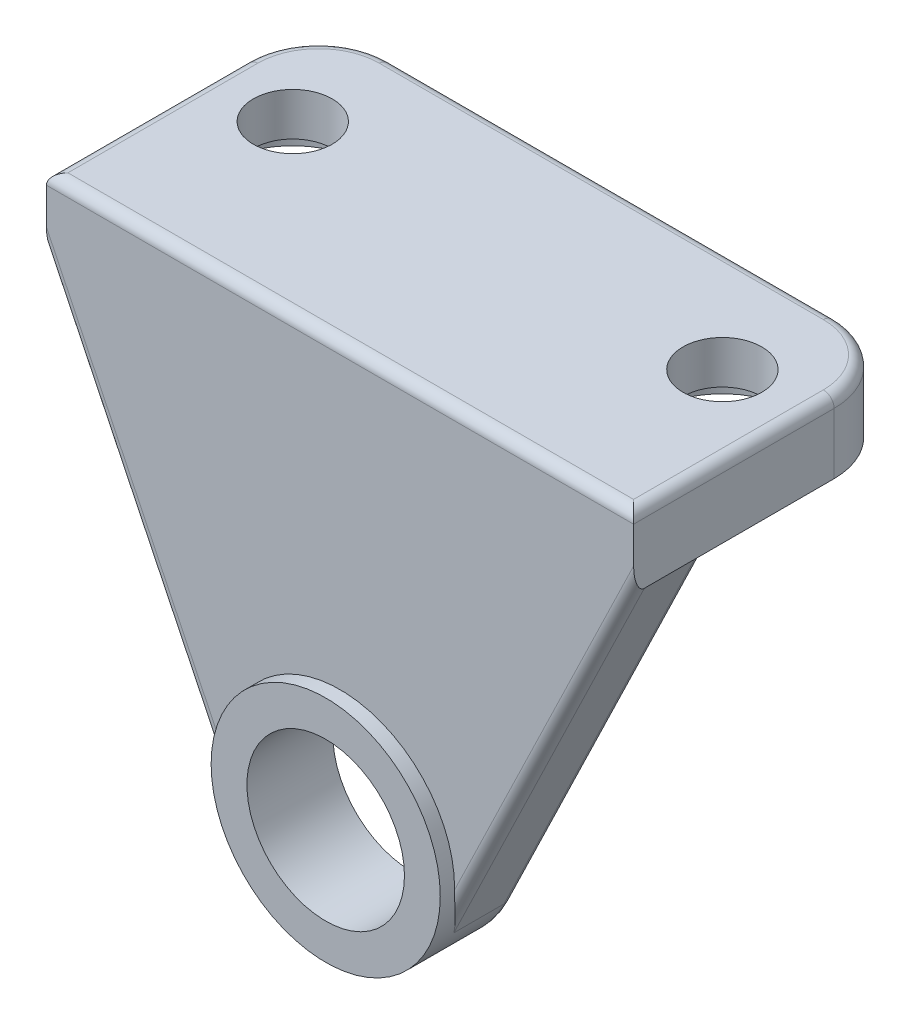
ISO-10303-21;
HEADER;
FILE_DESCRIPTION(('STEP AP214'),'2;1');
FILE_NAME('part.step','',(''),(''),'','','');
FILE_SCHEMA(('AUTOMOTIVE_DESIGN { 1 0 10303 214 1 1 1 1 }'));
ENDSEC;
DATA;
#1=APPLICATION_CONTEXT('core data for automotive mechanical design processes');
#2=APPLICATION_PROTOCOL_DEFINITION('international standard','automotive_design',2000,#1);
#3=PRODUCT_CONTEXT('',#1,'mechanical');
#4=PRODUCT('Part','Part','',(#3));
#5=PRODUCT_RELATED_PRODUCT_CATEGORY('part','',(#4));
#6=PRODUCT_DEFINITION_FORMATION('','',#4);
#7=PRODUCT_DEFINITION_CONTEXT('part definition',#1,'design');
#8=PRODUCT_DEFINITION('design','',#6,#7);
#9=PRODUCT_DEFINITION_SHAPE('','',#8);
#10=(LENGTH_UNIT() NAMED_UNIT(*) SI_UNIT(.MILLI.,.METRE.));
#11=(NAMED_UNIT(*) PLANE_ANGLE_UNIT() SI_UNIT($,.RADIAN.));
#12=(NAMED_UNIT(*) SI_UNIT($,.STERADIAN.) SOLID_ANGLE_UNIT());
#13=UNCERTAINTY_MEASURE_WITH_UNIT(LENGTH_MEASURE(1.E-05),#10,'distance_accuracy_value','');
#14=(GEOMETRIC_REPRESENTATION_CONTEXT(3) GLOBAL_UNCERTAINTY_ASSIGNED_CONTEXT((#13)) GLOBAL_UNIT_ASSIGNED_CONTEXT((#10,
#11,#12)) REPRESENTATION_CONTEXT('',''));
#15=CARTESIAN_POINT('',(0.,0.,0.));
#16=DIRECTION('',(0.,0.,1.));
#17=DIRECTION('',(1.,0.,0.));
#18=AXIS2_PLACEMENT_3D('',#15,#16,#17);
#19=CARTESIAN_POINT('',(-164.012658914919,48.,-38.));
#20=DIRECTION('',(0.,1.,0.));
#21=DIRECTION('',(0.,0.,1.));
#22=AXIS2_PLACEMENT_3D('',#19,#20,#21);
#23=PLANE('',#22);
#24=CARTESIAN_POINT('',(30.,48.,-23.4));
#25=DIRECTION('',(0.,-1.,0.));
#26=DIRECTION('',(0.,0.,-1.));
#27=AXIS2_PLACEMENT_3D('',#24,#25,#26);
#28=CIRCLE('',#27,9.99999999999998);
#29=CARTESIAN_POINT('',(30.,48.,-33.4));
#30=VERTEX_POINT('',#29);
#31=EDGE_CURVE('E438',#30,#30,#28,.T.);
#32=ORIENTED_EDGE('',*,*,#31,.F.);
#33=EDGE_LOOP('',(#32));
#34=FACE_BOUND('',#33,.T.);
#35=DIRECTION('',(0.,0.,1.));
#36=VECTOR('',#35,1.);
#37=CARTESIAN_POINT('',(-41.,48.,-38.));
#38=LINE('',#37,#36);
#39=CARTESIAN_POINT('',(-41.,48.,-28.));
#40=VERTEX_POINT('',#39);
#41=CARTESIAN_POINT('',(-41.,48.,-8.5));
#42=VERTEX_POINT('',#41);
#43=EDGE_CURVE('E55',#40,#42,#38,.T.);
#44=ORIENTED_EDGE('',*,*,#43,.F.);
#45=CARTESIAN_POINT('',(-31.,48.,-28.));
#46=DIRECTION('',(0.,1.,0.));
#47=DIRECTION('',(0.,0.,1.));
#48=AXIS2_PLACEMENT_3D('',#45,#46,#47);
#49=CIRCLE('',#48,10.);
#50=CARTESIAN_POINT('',(-31.,48.,-38.));
#51=VERTEX_POINT('',#50);
#52=EDGE_CURVE('E168',#40,#51,#49,.F.);
#53=ORIENTED_EDGE('',*,*,#52,.T.);
#54=DIRECTION('',(-1.,0.,0.));
#55=VECTOR('',#54,1.);
#56=CARTESIAN_POINT('',(0.,48.,-38.));
#57=LINE('',#56,#55);
#58=CARTESIAN_POINT('',(31.,48.,-38.));
#59=VERTEX_POINT('',#58);
#60=EDGE_CURVE('E151',#59,#51,#57,.T.);
#61=ORIENTED_EDGE('',*,*,#60,.F.);
#62=CARTESIAN_POINT('',(31.,48.,-28.));
#63=DIRECTION('',(0.,1.,0.));
#64=DIRECTION('',(0.,0.,1.));
#65=AXIS2_PLACEMENT_3D('',#62,#63,#64);
#66=CIRCLE('',#65,10.);
#67=CARTESIAN_POINT('',(41.,48.,-28.));
#68=VERTEX_POINT('',#67);
#69=EDGE_CURVE('E165',#59,#68,#66,.F.);
#70=ORIENTED_EDGE('',*,*,#69,.T.);
#71=DIRECTION('',(0.,0.,1.));
#72=VECTOR('',#71,1.);
#73=CARTESIAN_POINT('',(41.,48.,-38.));
#74=LINE('',#73,#72);
#75=CARTESIAN_POINT('',(41.,48.,-8.5));
#76=VERTEX_POINT('',#75);
#77=EDGE_CURVE('E409',#68,#76,#74,.T.);
#78=ORIENTED_EDGE('',*,*,#77,.T.);
#79=CARTESIAN_POINT('',(39.3336334098914,48.,-8.5));
#80=DIRECTION('',(0.,1.,0.));
#81=DIRECTION('',(1.,0.,0.));
#82=AXIS2_PLACEMENT_3D('',#79,#80,#81);
#83=ELLIPSE('',#82,1.66636659010857,1.5);
#84=CARTESIAN_POINT('',(39.3336334098914,48.,-10.));
#85=VERTEX_POINT('',#84);
#86=EDGE_CURVE('E246',#76,#85,#83,.T.);
#87=ORIENTED_EDGE('',*,*,#86,.T.);
#88=DIRECTION('',(1.,0.,0.));
#89=VECTOR('',#88,1.);
#90=CARTESIAN_POINT('',(-164.012658914919,48.,-10.));
#91=LINE('',#90,#89);
#92=CARTESIAN_POINT('',(-39.3336334098914,48.,-10.));
#93=VERTEX_POINT('',#92);
#94=EDGE_CURVE('E417',#93,#85,#91,.T.);
#95=ORIENTED_EDGE('',*,*,#94,.F.);
#96=CARTESIAN_POINT('',(-39.3336334098914,48.,-8.5));
#97=DIRECTION('',(0.,1.,0.));
#98=DIRECTION('',(1.,0.,0.));
#99=AXIS2_PLACEMENT_3D('',#96,#97,#98);
#100=ELLIPSE('',#99,1.66636659010857,1.5);
#101=EDGE_CURVE('E243',#93,#42,#100,.T.);
#102=ORIENTED_EDGE('',*,*,#101,.T.);
#103=EDGE_LOOP('',(#44,#53,#61,#70,#78,#87,#95,#102));
#104=FACE_BOUND('',#103,.T.);
#105=CARTESIAN_POINT('',(-30.,48.,-23.4));
#106=DIRECTION('',(0.,-1.,0.));
#107=DIRECTION('',(0.,0.,-1.));
#108=AXIS2_PLACEMENT_3D('',#105,#106,#107);
#109=CIRCLE('',#108,9.99999999999999);
#110=CARTESIAN_POINT('',(-30.,48.,-33.4));
#111=VERTEX_POINT('',#110);
#112=EDGE_CURVE('E371',#111,#111,#109,.T.);
#113=ORIENTED_EDGE('',*,*,#112,.F.);
#114=EDGE_LOOP('',(#113));
#115=FACE_BOUND('',#114,.T.);
#116=ADVANCED_FACE('F36',(#34,#104,#115),#23,.F.);
#117=CARTESIAN_POINT('',(-41.,58.,-38.));
#118=DIRECTION('',(0.,-1.,0.));
#119=DIRECTION('',(1.,0.,0.));
#120=AXIS2_PLACEMENT_3D('',#117,#118,#119);
#121=PLANE('',#120);
#122=DIRECTION('',(0.,0.,1.));
#123=VECTOR('',#122,1.);
#124=CARTESIAN_POINT('',(39.5,58.,-28.));
#125=LINE('',#124,#123);
#126=CARTESIAN_POINT('',(39.5,58.,-1.5));
#127=VERTEX_POINT('',#126);
#128=CARTESIAN_POINT('',(39.5,58.,-28.));
#129=VERTEX_POINT('',#128);
#130=EDGE_CURVE('E213',#127,#129,#125,.F.);
#131=ORIENTED_EDGE('',*,*,#130,.T.);
#132=CARTESIAN_POINT('',(31.,58.,-28.));
#133=DIRECTION('',(0.,-1.,0.));
#134=DIRECTION('',(1.,0.,0.));
#135=AXIS2_PLACEMENT_3D('',#132,#133,#134);
#136=CIRCLE('',#135,8.5);
#137=CARTESIAN_POINT('',(31.,58.,-36.5));
#138=VERTEX_POINT('',#137);
#139=EDGE_CURVE('E215',#129,#138,#136,.F.);
#140=ORIENTED_EDGE('',*,*,#139,.T.);
#141=DIRECTION('',(1.,0.,0.));
#142=VECTOR('',#141,1.);
#143=CARTESIAN_POINT('',(-41.,58.,-36.5));
#144=LINE('',#143,#142);
#145=CARTESIAN_POINT('',(-31.,58.,-36.5));
#146=VERTEX_POINT('',#145);
#147=EDGE_CURVE('E205',#138,#146,#144,.F.);
#148=ORIENTED_EDGE('',*,*,#147,.T.);
#149=CARTESIAN_POINT('',(-31.,58.,-28.));
#150=DIRECTION('',(0.,-1.,0.));
#151=DIRECTION('',(1.,0.,0.));
#152=AXIS2_PLACEMENT_3D('',#149,#150,#151);
#153=CIRCLE('',#152,8.5);
#154=CARTESIAN_POINT('',(-39.5,58.,-28.));
#155=VERTEX_POINT('',#154);
#156=EDGE_CURVE('E207',#146,#155,#153,.F.);
#157=ORIENTED_EDGE('',*,*,#156,.T.);
#158=DIRECTION('',(0.,0.,1.));
#159=VECTOR('',#158,1.);
#160=CARTESIAN_POINT('',(-39.5,58.,-38.));
#161=LINE('',#160,#159);
#162=CARTESIAN_POINT('',(-39.5,58.,-1.5));
#163=VERTEX_POINT('',#162);
#164=EDGE_CURVE('E209',#155,#163,#161,.T.);
#165=ORIENTED_EDGE('',*,*,#164,.T.);
#166=DIRECTION('',(1.,0.,0.));
#167=VECTOR('',#166,1.);
#168=CARTESIAN_POINT('',(41.,58.,-1.5));
#169=LINE('',#168,#167);
#170=EDGE_CURVE('E211',#163,#127,#169,.T.);
#171=ORIENTED_EDGE('',*,*,#170,.T.);
#172=EDGE_LOOP('',(#131,#140,#148,#157,#165,#171));
#173=FACE_BOUND('',#172,.T.);
#174=CARTESIAN_POINT('',(30.,58.,-23.4));
#175=DIRECTION('',(0.,-1.,0.));
#176=DIRECTION('',(0.,0.,-1.));
#177=AXIS2_PLACEMENT_3D('',#174,#175,#176);
#178=CIRCLE('',#177,5.50000000000001);
#179=CARTESIAN_POINT('',(30.,58.,-28.9));
#180=VERTEX_POINT('',#179);
#181=EDGE_CURVE('E429',#180,#180,#178,.T.);
#182=ORIENTED_EDGE('',*,*,#181,.T.);
#183=EDGE_LOOP('',(#182));
#184=FACE_BOUND('',#183,.T.);
#185=CARTESIAN_POINT('',(-30.,58.,-23.4));
#186=DIRECTION('',(0.,-1.,0.));
#187=DIRECTION('',(0.,0.,-1.));
#188=AXIS2_PLACEMENT_3D('',#185,#186,#187);
#189=CIRCLE('',#188,5.50000000000001);
#190=CARTESIAN_POINT('',(-30.,58.,-28.9));
#191=VERTEX_POINT('',#190);
#192=EDGE_CURVE('E441',#191,#191,#189,.T.);
#193=ORIENTED_EDGE('',*,*,#192,.T.);
#194=EDGE_LOOP('',(#193));
#195=FACE_BOUND('',#194,.T.);
#196=ADVANCED_FACE('F316',(#173,#184,#195),#121,.F.);
#197=CARTESIAN_POINT('',(0.,0.,-38.));
#198=DIRECTION('',(0.,0.,1.));
#199=DIRECTION('',(1.,0.,0.));
#200=AXIS2_PLACEMENT_3D('',#197,#198,#199);
#201=CYLINDRICAL_SURFACE('',#200,16.);
#202=DIRECTION('',(0.,0.,1.));
#203=VECTOR('',#202,1.);
#204=CARTESIAN_POINT('',(-14.4025931283442,-6.96888163046068,-38.));
#205=LINE('',#204,#203);
#206=CARTESIAN_POINT('',(-14.4025931283442,-6.96888163046068,-8.5));
#207=VERTEX_POINT('',#206);
#208=CARTESIAN_POINT('',(-14.4025931283442,-6.96888163046068,-1.5));
#209=VERTEX_POINT('',#208);
#210=EDGE_CURVE('E169',#207,#209,#205,.T.);
#211=ORIENTED_EDGE('',*,*,#210,.F.);
#212=CARTESIAN_POINT('',(0.,0.,-8.5));
#213=DIRECTION('',(0.,0.,1.));
#214=DIRECTION('',(0.,-1.,0.));
#215=AXIS2_PLACEMENT_3D('',#212,#213,#214);
#216=CIRCLE('',#215,16.);
#217=CARTESIAN_POINT('',(14.4025931283442,-6.96888163046068,-8.5));
#218=VERTEX_POINT('',#217);
#219=EDGE_CURVE('E203',#207,#218,#216,.T.);
#220=ORIENTED_EDGE('',*,*,#219,.T.);
#221=DIRECTION('',(0.,0.,1.));
#222=VECTOR('',#221,1.);
#223=CARTESIAN_POINT('',(14.4025931283442,-6.96888163046068,-38.));
#224=LINE('',#223,#222);
#225=CARTESIAN_POINT('',(14.4025931283442,-6.96888163046068,-1.5));
#226=VERTEX_POINT('',#225);
#227=EDGE_CURVE('E193',#218,#226,#224,.T.);
#228=ORIENTED_EDGE('',*,*,#227,.T.);
#229=CARTESIAN_POINT('',(15.9983901259626,-0.226965586605466,0.));
#230=CARTESIAN_POINT('',(15.9965838851266,-0.354482405872986,-2.54390660362477E-05));
#231=CARTESIAN_POINT('',(15.99324802249,-0.481945304262293,-0.00290536536573818));
#232=CARTESIAN_POINT('',(15.9835467885786,-0.736493711316117,-0.0136774598857194));
#233=CARTESIAN_POINT('',(15.9771827080948,-0.863579357583061,-0.021567493005181));
#234=CARTESIAN_POINT('',(15.9614681302463,-1.11697174134248,-0.0416451820041529));
#235=CARTESIAN_POINT('',(15.9521233300004,-1.24327949997777,-0.0538246439857067));
#236=CARTESIAN_POINT('',(15.9304827566261,-1.49522905868356,-0.0819426286752582));
#237=CARTESIAN_POINT('',(15.9181866256102,-1.62087077609784,-0.0978816072697057));
#238=CARTESIAN_POINT('',(15.8770443412948,-1.9956034774908,-0.150470590463817));
#239=CARTESIAN_POINT('',(15.8438782574361,-2.24355655715325,-0.191984418831265));
#240=CARTESIAN_POINT('',(15.7663286088091,-2.73588336543472,-0.285031259189174));
#241=CARTESIAN_POINT('',(15.7219381708936,-2.98025480350905,-0.336570405628843));
#242=CARTESIAN_POINT('',(15.6050583014365,-3.54864740254916,-0.466461292089114));
#243=CARTESIAN_POINT('',(15.5281583207196,-3.87106029130972,-0.547928820214518));
#244=CARTESIAN_POINT('',(15.3553444320515,-4.50803618362231,-0.720340395044808));
#245=CARTESIAN_POINT('',(15.2594287056812,-4.8225984331996,-0.811285347652766));
#246=CARTESIAN_POINT('',(14.9438138023887,-5.75433319956717,-1.09308644318132));
#247=CARTESIAN_POINT('',(14.6961996768158,-6.35978040111449,-1.29296572789201));
#248=CARTESIAN_POINT('',(14.4096115536977,-6.95436264243241,-1.49506235149203));
#249=CARTESIAN_POINT('',(14.4061050522366,-6.96162352523192,-1.49753120660401));
#250=CARTESIAN_POINT('',(14.4025931283442,-6.96888163046068,-1.5));
#251=B_SPLINE_CURVE_WITH_KNOTS('',3,(#229,#230,#231,#232,#233,#234,#235,#236,#237,#238,#239,
#240,#241,#242,#243,#244,#245,#246,#247,#248,#249,#250),.UNSPECIFIED.,.F.,.F.,(4,2,2,2,2,2,2,2,
2,2,4),(0.,0.382501537564101,0.764840178051784,1.1464523811574,1.52811088312843,
2.28825350975727,3.04886273592473,4.07189168749172,5.09501851550318,7.14056143828107,
7.165859666171),.UNSPECIFIED.);
#252=CARTESIAN_POINT('',(15.9983901259626,-0.226965586605466,0.));
#253=VERTEX_POINT('',#252);
#254=EDGE_CURVE('E47',#226,#253,#251,.F.);
#255=ORIENTED_EDGE('',*,*,#254,.T.);
#256=CARTESIAN_POINT('',(0.,0.,0.));
#257=DIRECTION('',(0.,0.,1.));
#258=DIRECTION('',(1.,0.,0.));
#259=AXIS2_PLACEMENT_3D('',#256,#257,#258);
#260=CIRCLE('',#259,16.);
#261=CARTESIAN_POINT('',(-15.9983901259626,-0.226965586605454,0.));
#262=VERTEX_POINT('',#261);
#263=EDGE_CURVE('E160',#253,#262,#260,.T.);
#264=ORIENTED_EDGE('',*,*,#263,.T.);
#265=CARTESIAN_POINT('',(-15.9983901259626,-0.226965586605454,0.));
#266=CARTESIAN_POINT('',(-15.9965838851266,-0.354482405873452,-2.54390660387299E-05));
#267=CARTESIAN_POINT('',(-15.9932480224899,-0.481945304263236,-0.00290536536576218));
#268=CARTESIAN_POINT('',(-15.9835467885785,-0.736493711318013,-0.0136774598858207));
#269=CARTESIAN_POINT('',(-15.9771827080947,-0.863579357585432,-0.0215674930053381));
#270=CARTESIAN_POINT('',(-15.9614681302461,-1.11697174134569,-0.0416451820044435));
#271=CARTESIAN_POINT('',(-15.9521233300002,-1.24327949998135,-0.0538246439860715));
#272=CARTESIAN_POINT('',(-15.9304827566257,-1.49522905868786,-0.0819426286757815));
#273=CARTESIAN_POINT('',(-15.9181866256098,-1.6208707761025,-0.0978816072703131));
#274=CARTESIAN_POINT('',(-15.8770443412942,-1.9956034774949,-0.150470590464498));
#275=CARTESIAN_POINT('',(-15.8438782574356,-2.24355655715644,-0.191984418831901));
#276=CARTESIAN_POINT('',(-15.7663286088088,-2.73588336543627,-0.285031259189445));
#277=CARTESIAN_POINT('',(-15.7219381708934,-2.98025480350987,-0.336570405628798));
#278=CARTESIAN_POINT('',(-15.6050583014366,-3.54864740254896,-0.466461292089406));
#279=CARTESIAN_POINT('',(-15.5281583207198,-3.87106029130915,-0.547928820215801));
#280=CARTESIAN_POINT('',(-15.3553444320515,-4.50803618362212,-0.720340395043345));
#281=CARTESIAN_POINT('',(-15.2594287056807,-4.82259843320016,-0.811285347647561));
#282=CARTESIAN_POINT('',(-14.9438138023904,-5.75433319956375,-1.09308644319111));
#283=CARTESIAN_POINT('',(-14.6961996768233,-6.35978040109917,-1.2929657279465));
#284=CARTESIAN_POINT('',(-14.4096115536978,-6.95436264243206,-1.49506235149338));
#285=CARTESIAN_POINT('',(-14.4061050522367,-6.96162352523174,-1.49753120660469));
#286=CARTESIAN_POINT('',(-14.4025931283442,-6.96888163046068,-1.5));
#287=B_SPLINE_CURVE_WITH_KNOTS('',3,(#265,#266,#267,#268,#269,#270,#271,#272,#273,#274,#275,
#276,#277,#278,#279,#280,#281,#282,#283,#284,#285,#286),.UNSPECIFIED.,.F.,.F.,(4,2,2,2,2,2,2,2,
2,2,4),(0.,0.382501537565535,0.764840178054653,1.14645238116139,1.52811088313354,
2.28825350975967,3.04886273592473,4.07189168749141,5.09501851550205,7.14056143828109,
7.165859666171),.UNSPECIFIED.);
#288=EDGE_CURVE('E11',#262,#209,#287,.T.);
#289=ORIENTED_EDGE('',*,*,#288,.T.);
#290=EDGE_LOOP('',(#211,#220,#228,#255,#264,#289));
#291=FACE_BOUND('',#290,.T.);
#292=CARTESIAN_POINT('',(0.,0.,2.));
#293=DIRECTION('',(0.,0.,1.));
#294=DIRECTION('',(1.,0.,0.));
#295=AXIS2_PLACEMENT_3D('',#292,#293,#294);
#296=CIRCLE('',#295,16.);
#297=CARTESIAN_POINT('',(16.,0.,2.));
#298=VERTEX_POINT('',#297);
#299=EDGE_CURVE('E420',#298,#298,#296,.T.);
#300=ORIENTED_EDGE('',*,*,#299,.F.);
#301=EDGE_LOOP('',(#300));
#302=FACE_BOUND('',#301,.T.);
#303=ADVANCED_FACE('F258',(#291,#302),#201,.T.);
#304=CARTESIAN_POINT('',(-14.4025931283442,-6.96888163046068,-38.));
#305=DIRECTION('',(0.900162070521513,0.435555101903792,0.));
#306=DIRECTION('',(-0.435555101903792,0.900162070521513,0.));
#307=AXIS2_PLACEMENT_3D('',#304,#305,#306);
#308=PLANE('',#307);
#309=CARTESIAN_POINT('',(-41.,48.,-1.5));
#310=VERTEX_POINT('',#309);
#311=EDGE_CURVE('E410',#42,#310,#38,.T.);
#312=ORIENTED_EDGE('',*,*,#311,.F.);
#313=DIRECTION('',(0.435555101903792,-0.900162070521513,0.));
#314=VECTOR('',#313,1.);
#315=CARTESIAN_POINT('',(-14.4025931283442,-6.96888163046068,-8.5));
#316=LINE('',#315,#314);
#317=EDGE_CURVE('E492',#42,#207,#316,.T.);
#318=ORIENTED_EDGE('',*,*,#317,.T.);
#319=ORIENTED_EDGE('',*,*,#210,.T.);
#320=DIRECTION('',(-0.435555101903792,0.900162070521513,0.));
#321=VECTOR('',#320,1.);
#322=CARTESIAN_POINT('',(-41.,48.,-1.5));
#323=LINE('',#322,#321);
#324=EDGE_CURVE('E182',#209,#310,#323,.T.);
#325=ORIENTED_EDGE('',*,*,#324,.T.);
#326=EDGE_LOOP('',(#312,#318,#319,#325));
#327=FACE_BOUND('',#326,.T.);
#328=ADVANCED_FACE('F340',(#327),#308,.F.);
#329=CARTESIAN_POINT('',(-41.,48.,-38.));
#330=DIRECTION('',(1.,0.,0.));
#331=DIRECTION('',(0.,0.,-1.));
#332=AXIS2_PLACEMENT_3D('',#329,#330,#331);
#333=PLANE('',#332);
#334=DIRECTION('',(0.,1.,0.));
#335=VECTOR('',#334,1.);
#336=CARTESIAN_POINT('',(-41.,48.,0.));
#337=LINE('',#336,#335);
#338=CARTESIAN_POINT('',(-41.,51.4438811379859,0.));
#339=VERTEX_POINT('',#338);
#340=CARTESIAN_POINT('',(-41.,56.5,0.));
#341=VERTEX_POINT('',#340);
#342=EDGE_CURVE('E198',#339,#341,#337,.T.);
#343=ORIENTED_EDGE('',*,*,#342,.T.);
#344=DIRECTION('',(0.,0.,1.));
#345=VECTOR('',#344,1.);
#346=CARTESIAN_POINT('',(-41.,56.5,-38.));
#347=LINE('',#346,#345);
#348=CARTESIAN_POINT('',(-41.,56.5,-28.));
#349=VERTEX_POINT('',#348);
#350=EDGE_CURVE('E233',#341,#349,#347,.F.);
#351=ORIENTED_EDGE('',*,*,#350,.T.);
#352=DIRECTION('',(0.,1.,0.));
#353=VECTOR('',#352,1.);
#354=CARTESIAN_POINT('',(-41.,48.,-28.));
#355=LINE('',#354,#353);
#356=EDGE_CURVE('E175',#349,#40,#355,.F.);
#357=ORIENTED_EDGE('',*,*,#356,.T.);
#358=ORIENTED_EDGE('',*,*,#43,.T.);
#359=ORIENTED_EDGE('',*,*,#311,.T.);
#360=CARTESIAN_POINT('',(-41.,51.4438811379859,-1.5));
#361=DIRECTION('',(1.,0.,0.));
#362=DIRECTION('',(0.,-1.,0.));
#363=AXIS2_PLACEMENT_3D('',#360,#361,#362);
#364=ELLIPSE('',#363,3.44388113798591,1.5);
#365=EDGE_CURVE('E231',#310,#339,#364,.F.);
#366=ORIENTED_EDGE('',*,*,#365,.T.);
#367=EDGE_LOOP('',(#343,#351,#357,#358,#359,#366));
#368=FACE_BOUND('',#367,.T.);
#369=ADVANCED_FACE('F343',(#368),#333,.F.);
#370=CARTESIAN_POINT('',(41.,48.,-38.));
#371=DIRECTION('',(1.,0.,0.));
#372=DIRECTION('',(0.,0.,-1.));
#373=AXIS2_PLACEMENT_3D('',#370,#371,#372);
#374=PLANE('',#373);
#375=DIRECTION('',(0.,1.,0.));
#376=VECTOR('',#375,1.);
#377=CARTESIAN_POINT('',(41.,58.,-28.));
#378=LINE('',#377,#376);
#379=CARTESIAN_POINT('',(41.,56.5,-28.));
#380=VERTEX_POINT('',#379);
#381=EDGE_CURVE('E174',#68,#380,#378,.T.);
#382=ORIENTED_EDGE('',*,*,#381,.T.);
#383=DIRECTION('',(0.,0.,1.));
#384=VECTOR('',#383,1.);
#385=CARTESIAN_POINT('',(41.,56.5,0.));
#386=LINE('',#385,#384);
#387=CARTESIAN_POINT('',(41.,56.5,0.));
#388=VERTEX_POINT('',#387);
#389=EDGE_CURVE('E222',#380,#388,#386,.T.);
#390=ORIENTED_EDGE('',*,*,#389,.T.);
#391=DIRECTION('',(0.,1.,0.));
#392=VECTOR('',#391,1.);
#393=CARTESIAN_POINT('',(41.,48.,0.));
#394=LINE('',#393,#392);
#395=CARTESIAN_POINT('',(41.,51.4438811379859,0.));
#396=VERTEX_POINT('',#395);
#397=EDGE_CURVE('E415',#396,#388,#394,.T.);
#398=ORIENTED_EDGE('',*,*,#397,.F.);
#399=CARTESIAN_POINT('',(41.,51.4438811379859,-1.5));
#400=DIRECTION('',(1.,0.,0.));
#401=DIRECTION('',(0.,1.,0.));
#402=AXIS2_PLACEMENT_3D('',#399,#400,#401);
#403=ELLIPSE('',#402,3.44388113798591,1.5);
#404=CARTESIAN_POINT('',(41.,48.,-1.5));
#405=VERTEX_POINT('',#404);
#406=EDGE_CURVE('E220',#396,#405,#403,.T.);
#407=ORIENTED_EDGE('',*,*,#406,.T.);
#408=EDGE_CURVE('E197',#76,#405,#74,.T.);
#409=ORIENTED_EDGE('',*,*,#408,.F.);
#410=ORIENTED_EDGE('',*,*,#77,.F.);
#411=EDGE_LOOP('',(#382,#390,#398,#407,#409,#410));
#412=FACE_BOUND('',#411,.T.);
#413=ADVANCED_FACE('F346',(#412),#374,.T.);
#414=CARTESIAN_POINT('',(14.4025931283442,-6.96888163046068,-38.));
#415=DIRECTION('',(0.900162070521513,-0.435555101903792,0.));
#416=DIRECTION('',(0.435555101903792,0.900162070521513,0.));
#417=AXIS2_PLACEMENT_3D('',#414,#415,#416);
#418=PLANE('',#417);
#419=ORIENTED_EDGE('',*,*,#227,.F.);
#420=DIRECTION('',(-0.435555101903792,-0.900162070521513,0.));
#421=VECTOR('',#420,1.);
#422=CARTESIAN_POINT('',(41.,48.,-8.5));
#423=LINE('',#422,#421);
#424=EDGE_CURVE('E240',#218,#76,#423,.F.);
#425=ORIENTED_EDGE('',*,*,#424,.T.);
#426=ORIENTED_EDGE('',*,*,#408,.T.);
#427=DIRECTION('',(0.435555101903792,0.900162070521513,0.));
#428=VECTOR('',#427,1.);
#429=CARTESIAN_POINT('',(14.4025931283442,-6.96888163046068,-1.5));
#430=LINE('',#429,#428);
#431=EDGE_CURVE('E238',#405,#226,#430,.F.);
#432=ORIENTED_EDGE('',*,*,#431,.T.);
#433=EDGE_LOOP('',(#419,#425,#426,#432));
#434=FACE_BOUND('',#433,.T.);
#435=ADVANCED_FACE('F336',(#434),#418,.T.);
#436=CARTESIAN_POINT('',(0.,0.,-38.));
#437=DIRECTION('',(0.,0.,1.));
#438=DIRECTION('',(1.,0.,0.));
#439=AXIS2_PLACEMENT_3D('',#436,#437,#438);
#440=PLANE('',#439);
#441=DIRECTION('',(0.,1.,0.));
#442=VECTOR('',#441,1.);
#443=CARTESIAN_POINT('',(-31.,0.,-38.));
#444=LINE('',#443,#442);
#445=CARTESIAN_POINT('',(-31.,56.5,-38.));
#446=VERTEX_POINT('',#445);
#447=EDGE_CURVE('E159',#51,#446,#444,.T.);
#448=ORIENTED_EDGE('',*,*,#447,.T.);
#449=DIRECTION('',(1.,0.,0.));
#450=VECTOR('',#449,1.);
#451=CARTESIAN_POINT('',(0.,56.5,-38.));
#452=LINE('',#451,#450);
#453=CARTESIAN_POINT('',(31.,56.5,-38.));
#454=VERTEX_POINT('',#453);
#455=EDGE_CURVE('E154',#446,#454,#452,.T.);
#456=ORIENTED_EDGE('',*,*,#455,.T.);
#457=DIRECTION('',(0.,1.,0.));
#458=VECTOR('',#457,1.);
#459=CARTESIAN_POINT('',(31.,48.,-38.));
#460=LINE('',#459,#458);
#461=EDGE_CURVE('E147',#454,#59,#460,.F.);
#462=ORIENTED_EDGE('',*,*,#461,.T.);
#463=ORIENTED_EDGE('',*,*,#60,.T.);
#464=EDGE_LOOP('',(#448,#456,#462,#463));
#465=FACE_BOUND('',#464,.T.);
#466=ADVANCED_FACE('F150',(#465),#440,.F.);
#467=CARTESIAN_POINT('',(0.,0.,0.));
#468=DIRECTION('',(0.,0.,1.));
#469=DIRECTION('',(1.,0.,0.));
#470=AXIS2_PLACEMENT_3D('',#467,#468,#469);
#471=PLANE('',#470);
#472=ORIENTED_EDGE('',*,*,#397,.T.);
#473=DIRECTION('',(1.,0.,0.));
#474=VECTOR('',#473,1.);
#475=CARTESIAN_POINT('',(-41.,56.5,0.));
#476=LINE('',#475,#474);
#477=EDGE_CURVE('E229',#388,#341,#476,.F.);
#478=ORIENTED_EDGE('',*,*,#477,.T.);
#479=ORIENTED_EDGE('',*,*,#342,.F.);
#480=DIRECTION('',(-0.435555101903792,0.900162070521513,0.));
#481=VECTOR('',#480,1.);
#482=CARTESIAN_POINT('',(-13.0523500225619,-6.31554897760499,0.));
#483=LINE('',#482,#481);
#484=EDGE_CURVE('E224',#339,#262,#483,.F.);
#485=ORIENTED_EDGE('',*,*,#484,.T.);
#486=ORIENTED_EDGE('',*,*,#263,.F.);
#487=DIRECTION('',(0.435555101903792,0.900162070521513,0.));
#488=VECTOR('',#487,1.);
#489=CARTESIAN_POINT('',(13.0523500225619,-6.31554897760499,0.));
#490=LINE('',#489,#488);
#491=EDGE_CURVE('E226',#253,#396,#490,.T.);
#492=ORIENTED_EDGE('',*,*,#491,.T.);
#493=EDGE_LOOP('',(#472,#478,#479,#485,#486,#492));
#494=FACE_BOUND('',#493,.T.);
#495=ADVANCED_FACE('F332',(#494),#471,.T.);
#496=CARTESIAN_POINT('',(-164.012658914919,-38.8535040205495,-10.));
#497=DIRECTION('',(0.,0.,1.));
#498=DIRECTION('',(0.,-1.,0.));
#499=AXIS2_PLACEMENT_3D('',#496,#497,#498);
#500=PLANE('',#499);
#501=CARTESIAN_POINT('',(0.,0.,-10.));
#502=DIRECTION('',(0.,0.,1.));
#503=DIRECTION('',(0.,-1.,0.));
#504=AXIS2_PLACEMENT_3D('',#501,#502,#503);
#505=CIRCLE('',#504,11.);
#506=CARTESIAN_POINT('',(0.,-11.,-10.));
#507=VERTEX_POINT('',#506);
#508=EDGE_CURVE('E423',#507,#507,#505,.T.);
#509=ORIENTED_EDGE('',*,*,#508,.T.);
#510=EDGE_LOOP('',(#509));
#511=FACE_BOUND('',#510,.T.);
#512=CARTESIAN_POINT('',(0.,0.,-10.));
#513=DIRECTION('',(0.,0.,1.));
#514=DIRECTION('',(0.,-1.,0.));
#515=AXIS2_PLACEMENT_3D('',#512,#513,#514);
#516=CIRCLE('',#515,14.5);
#517=CARTESIAN_POINT('',(13.052350022562,-6.31554897760499,-10.));
#518=VERTEX_POINT('',#517);
#519=CARTESIAN_POINT('',(-13.0523500225619,-6.31554897760499,-10.));
#520=VERTEX_POINT('',#519);
#521=EDGE_CURVE('E370',#518,#520,#516,.F.);
#522=ORIENTED_EDGE('',*,*,#521,.T.);
#523=DIRECTION('',(0.435555101903792,-0.900162070521513,0.));
#524=VECTOR('',#523,1.);
#525=CARTESIAN_POINT('',(-28.9336035908993,26.5062502208565,-10.));
#526=LINE('',#525,#524);
#527=EDGE_CURVE('E199',#520,#93,#526,.F.);
#528=ORIENTED_EDGE('',*,*,#527,.T.);
#529=ORIENTED_EDGE('',*,*,#94,.T.);
#530=DIRECTION('',(-0.435555101903792,-0.900162070521513,0.));
#531=VECTOR('',#530,1.);
#532=CARTESIAN_POINT('',(13.052350022562,-6.31554897760499,-10.));
#533=LINE('',#532,#531);
#534=EDGE_CURVE('E489',#85,#518,#533,.T.);
#535=ORIENTED_EDGE('',*,*,#534,.T.);
#536=EDGE_LOOP('',(#522,#528,#529,#535));
#537=FACE_BOUND('',#536,.T.);
#538=ADVANCED_FACE('F329',(#511,#537),#500,.F.);
#539=CARTESIAN_POINT('',(0.,0.,2.));
#540=DIRECTION('',(0.,0.,1.));
#541=DIRECTION('',(1.,0.,0.));
#542=AXIS2_PLACEMENT_3D('',#539,#540,#541);
#543=PLANE('',#542);
#544=CARTESIAN_POINT('',(0.,0.,2.));
#545=DIRECTION('',(0.,0.,1.));
#546=DIRECTION('',(1.,0.,0.));
#547=AXIS2_PLACEMENT_3D('',#544,#545,#546);
#548=CIRCLE('',#547,11.);
#549=CARTESIAN_POINT('',(11.,0.,2.));
#550=VERTEX_POINT('',#549);
#551=EDGE_CURVE('E426',#550,#550,#548,.T.);
#552=ORIENTED_EDGE('',*,*,#551,.F.);
#553=EDGE_LOOP('',(#552));
#554=FACE_BOUND('',#553,.T.);
#555=ORIENTED_EDGE('',*,*,#299,.T.);
#556=EDGE_LOOP('',(#555));
#557=FACE_BOUND('',#556,.T.);
#558=ADVANCED_FACE('F327',(#554,#557),#543,.T.);
#559=CARTESIAN_POINT('',(0.,0.,-38.));
#560=DIRECTION('',(0.,0.,1.));
#561=DIRECTION('',(1.,0.,0.));
#562=AXIS2_PLACEMENT_3D('',#559,#560,#561);
#563=CYLINDRICAL_SURFACE('',#562,11.);
#564=ORIENTED_EDGE('',*,*,#551,.T.);
#565=EDGE_LOOP('',(#564));
#566=FACE_BOUND('',#565,.T.);
#567=ORIENTED_EDGE('',*,*,#508,.F.);
#568=EDGE_LOOP('',(#567));
#569=FACE_BOUND('',#568,.T.);
#570=ADVANCED_FACE('F475',(#566,#569),#563,.F.);
#571=CARTESIAN_POINT('',(30.,48.,-23.4));
#572=DIRECTION('',(0.,-1.,0.));
#573=DIRECTION('',(0.,0.,-1.));
#574=AXIS2_PLACEMENT_3D('',#571,#572,#573);
#575=CYLINDRICAL_SURFACE('',#574,5.50000000000001);
#576=CARTESIAN_POINT('',(30.,52.,-23.4));
#577=DIRECTION('',(0.,-1.,0.));
#578=DIRECTION('',(0.,0.,-1.));
#579=AXIS2_PLACEMENT_3D('',#576,#577,#578);
#580=CIRCLE('',#579,5.50000000000002);
#581=CARTESIAN_POINT('',(30.,52.,-28.9));
#582=VERTEX_POINT('',#581);
#583=EDGE_CURVE('E432',#582,#582,#580,.T.);
#584=ORIENTED_EDGE('',*,*,#583,.T.);
#585=EDGE_LOOP('',(#584));
#586=FACE_BOUND('',#585,.T.);
#587=ORIENTED_EDGE('',*,*,#181,.F.);
#588=EDGE_LOOP('',(#587));
#589=FACE_BOUND('',#588,.T.);
#590=ADVANCED_FACE('F472',(#586,#589),#575,.F.);
#591=CARTESIAN_POINT('',(35.5,52.,-23.4));
#592=DIRECTION('',(0.,-1.,0.));
#593=DIRECTION('',(0.,0.,-1.));
#594=AXIS2_PLACEMENT_3D('',#591,#592,#593);
#595=PLANE('',#594);
#596=CARTESIAN_POINT('',(30.,52.,-23.4));
#597=DIRECTION('',(0.,-1.,0.));
#598=DIRECTION('',(0.,0.,-1.));
#599=AXIS2_PLACEMENT_3D('',#596,#597,#598);
#600=CIRCLE('',#599,9.99999999999999);
#601=CARTESIAN_POINT('',(30.,52.,-33.4));
#602=VERTEX_POINT('',#601);
#603=EDGE_CURVE('E435',#602,#602,#600,.T.);
#604=ORIENTED_EDGE('',*,*,#603,.T.);
#605=EDGE_LOOP('',(#604));
#606=FACE_BOUND('',#605,.T.);
#607=ORIENTED_EDGE('',*,*,#583,.F.);
#608=EDGE_LOOP('',(#607));
#609=FACE_BOUND('',#608,.T.);
#610=ADVANCED_FACE('F466',(#606,#609),#595,.T.);
#611=CARTESIAN_POINT('',(30.,48.,-23.4));
#612=DIRECTION('',(0.,-1.,0.));
#613=DIRECTION('',(0.,0.,-1.));
#614=AXIS2_PLACEMENT_3D('',#611,#612,#613);
#615=CYLINDRICAL_SURFACE('',#614,9.99999999999999);
#616=ORIENTED_EDGE('',*,*,#31,.T.);
#617=EDGE_LOOP('',(#616));
#618=FACE_BOUND('',#617,.T.);
#619=ORIENTED_EDGE('',*,*,#603,.F.);
#620=EDGE_LOOP('',(#619));
#621=FACE_BOUND('',#620,.T.);
#622=ADVANCED_FACE('F459',(#618,#621),#615,.F.);
#623=CARTESIAN_POINT('',(-30.,48.,-23.4));
#624=DIRECTION('',(0.,-1.,0.));
#625=DIRECTION('',(0.,0.,-1.));
#626=AXIS2_PLACEMENT_3D('',#623,#624,#625);
#627=CYLINDRICAL_SURFACE('',#626,5.50000000000001);
#628=CARTESIAN_POINT('',(-30.,52.,-23.4));
#629=DIRECTION('',(0.,-1.,0.));
#630=DIRECTION('',(0.,0.,-1.));
#631=AXIS2_PLACEMENT_3D('',#628,#629,#630);
#632=CIRCLE('',#631,5.50000000000002);
#633=CARTESIAN_POINT('',(-30.,52.,-28.9));
#634=VERTEX_POINT('',#633);
#635=EDGE_CURVE('E444',#634,#634,#632,.T.);
#636=ORIENTED_EDGE('',*,*,#635,.T.);
#637=EDGE_LOOP('',(#636));
#638=FACE_BOUND('',#637,.T.);
#639=ORIENTED_EDGE('',*,*,#192,.F.);
#640=EDGE_LOOP('',(#639));
#641=FACE_BOUND('',#640,.T.);
#642=ADVANCED_FACE('F453',(#638,#641),#627,.F.);
#643=CARTESIAN_POINT('',(-24.5,52.,-23.4));
#644=DIRECTION('',(0.,-1.,0.));
#645=DIRECTION('',(0.,0.,-1.));
#646=AXIS2_PLACEMENT_3D('',#643,#644,#645);
#647=PLANE('',#646);
#648=CARTESIAN_POINT('',(-30.,52.,-23.4));
#649=DIRECTION('',(0.,-1.,0.));
#650=DIRECTION('',(0.,0.,-1.));
#651=AXIS2_PLACEMENT_3D('',#648,#649,#650);
#652=CIRCLE('',#651,9.99999999999999);
#653=CARTESIAN_POINT('',(-30.,52.,-33.4));
#654=VERTEX_POINT('',#653);
#655=EDGE_CURVE('E375',#654,#654,#652,.T.);
#656=ORIENTED_EDGE('',*,*,#655,.T.);
#657=EDGE_LOOP('',(#656));
#658=FACE_BOUND('',#657,.T.);
#659=ORIENTED_EDGE('',*,*,#635,.F.);
#660=EDGE_LOOP('',(#659));
#661=FACE_BOUND('',#660,.T.);
#662=ADVANCED_FACE('F311',(#658,#661),#647,.T.);
#663=CARTESIAN_POINT('',(-30.,48.,-23.4));
#664=DIRECTION('',(0.,-1.,0.));
#665=DIRECTION('',(0.,0.,-1.));
#666=AXIS2_PLACEMENT_3D('',#663,#664,#665);
#667=CYLINDRICAL_SURFACE('',#666,9.99999999999999);
#668=ORIENTED_EDGE('',*,*,#112,.T.);
#669=EDGE_LOOP('',(#668));
#670=FACE_BOUND('',#669,.T.);
#671=ORIENTED_EDGE('',*,*,#655,.F.);
#672=EDGE_LOOP('',(#671));
#673=FACE_BOUND('',#672,.T.);
#674=ADVANCED_FACE('F306',(#670,#673),#667,.F.);
#675=CARTESIAN_POINT('',(-31.,0.,-28.));
#676=DIRECTION('',(0.,1.,0.));
#677=DIRECTION('',(0.,0.,1.));
#678=AXIS2_PLACEMENT_3D('',#675,#676,#677);
#679=CYLINDRICAL_SURFACE('',#678,10.);
#680=ORIENTED_EDGE('',*,*,#356,.F.);
#681=CARTESIAN_POINT('',(-31.,56.5,-28.));
#682=DIRECTION('',(0.,-1.,0.));
#683=DIRECTION('',(1.,0.,0.));
#684=AXIS2_PLACEMENT_3D('',#681,#682,#683);
#685=CIRCLE('',#684,10.);
#686=EDGE_CURVE('E235',#349,#446,#685,.T.);
#687=ORIENTED_EDGE('',*,*,#686,.T.);
#688=ORIENTED_EDGE('',*,*,#447,.F.);
#689=ORIENTED_EDGE('',*,*,#52,.F.);
#690=EDGE_LOOP('',(#680,#687,#688,#689));
#691=FACE_BOUND('',#690,.T.);
#692=ADVANCED_FACE('F304',(#691),#679,.T.);
#693=CARTESIAN_POINT('',(31.,48.,-28.));
#694=DIRECTION('',(0.,-1.,0.));
#695=DIRECTION('',(0.,0.,-1.));
#696=AXIS2_PLACEMENT_3D('',#693,#694,#695);
#697=CYLINDRICAL_SURFACE('',#696,10.);
#698=ORIENTED_EDGE('',*,*,#461,.F.);
#699=CARTESIAN_POINT('',(31.,56.5,-28.));
#700=DIRECTION('',(0.,-1.,0.));
#701=DIRECTION('',(1.,0.,0.));
#702=AXIS2_PLACEMENT_3D('',#699,#700,#701);
#703=CIRCLE('',#702,10.);
#704=EDGE_CURVE('E218',#454,#380,#703,.T.);
#705=ORIENTED_EDGE('',*,*,#704,.T.);
#706=ORIENTED_EDGE('',*,*,#381,.F.);
#707=ORIENTED_EDGE('',*,*,#69,.F.);
#708=EDGE_LOOP('',(#698,#705,#706,#707));
#709=FACE_BOUND('',#708,.T.);
#710=ADVANCED_FACE('F172',(#709),#697,.T.);
#711=CARTESIAN_POINT('',(-33.2955043587824,-102.102695958048,-8.5));
#712=DIRECTION('',(0.435555101903792,0.900162070521513,0.));
#713=DIRECTION('',(-0.900162070521513,0.435555101903792,0.));
#714=AXIS2_PLACEMENT_3D('',#711,#712,#713);
#715=CYLINDRICAL_SURFACE('',#714,1.5);
#716=ORIENTED_EDGE('',*,*,#86,.F.);
#717=ORIENTED_EDGE('',*,*,#424,.F.);
#718=CARTESIAN_POINT('',(13.052350022562,-6.31554897760499,-8.5));
#719=DIRECTION('',(-0.435555101903792,-0.900162070521513,0.));
#720=DIRECTION('',(0.900162070521513,-0.435555101903792,0.));
#721=AXIS2_PLACEMENT_3D('',#718,#719,#720);
#722=CIRCLE('',#721,1.5);
#723=EDGE_CURVE('E365',#518,#218,#722,.T.);
#724=ORIENTED_EDGE('',*,*,#723,.F.);
#725=ORIENTED_EDGE('',*,*,#534,.F.);
#726=EDGE_LOOP('',(#716,#717,#724,#725));
#727=FACE_BOUND('',#726,.T.);
#728=ADVANCED_FACE('F292',(#727),#715,.T.);
#729=CARTESIAN_POINT('',(0.,0.,-8.5));
#730=DIRECTION('',(0.,0.,1.));
#731=DIRECTION('',(0.,-1.,0.));
#732=AXIS2_PLACEMENT_3D('',#729,#730,#731);
#733=TOROIDAL_SURFACE('',#732,14.5,1.5);
#734=ORIENTED_EDGE('',*,*,#723,.T.);
#735=ORIENTED_EDGE('',*,*,#219,.F.);
#736=CARTESIAN_POINT('',(-13.0523500225619,-6.31554897760499,-8.5));
#737=DIRECTION('',(-0.435555101903792,0.900162070521513,0.));
#738=DIRECTION('',(-0.900162070521513,-0.435555101903792,0.));
#739=AXIS2_PLACEMENT_3D('',#736,#737,#738);
#740=CIRCLE('',#739,1.5);
#741=EDGE_CURVE('E372',#520,#207,#740,.T.);
#742=ORIENTED_EDGE('',*,*,#741,.F.);
#743=ORIENTED_EDGE('',*,*,#521,.F.);
#744=EDGE_LOOP('',(#734,#735,#742,#743));
#745=FACE_BOUND('',#744,.T.);
#746=ADVANCED_FACE('F295',(#745),#733,.T.);
#747=CARTESIAN_POINT('',(-13.0523500225619,-6.31554897760499,-8.5));
#748=DIRECTION('',(0.435555101903792,-0.900162070521513,0.));
#749=DIRECTION('',(0.900162070521513,0.435555101903792,0.));
#750=AXIS2_PLACEMENT_3D('',#747,#748,#749);
#751=CYLINDRICAL_SURFACE('',#750,1.5);
#752=ORIENTED_EDGE('',*,*,#101,.F.);
#753=ORIENTED_EDGE('',*,*,#527,.F.);
#754=ORIENTED_EDGE('',*,*,#741,.T.);
#755=ORIENTED_EDGE('',*,*,#317,.F.);
#756=EDGE_LOOP('',(#752,#753,#754,#755));
#757=FACE_BOUND('',#756,.T.);
#758=ADVANCED_FACE('F272',(#757),#751,.T.);
#759=CARTESIAN_POINT('',(-39.5,56.5,-38.));
#760=DIRECTION('',(0.,0.,1.));
#761=DIRECTION('',(1.,0.,0.));
#762=AXIS2_PLACEMENT_3D('',#759,#760,#761);
#763=CYLINDRICAL_SURFACE('',#762,1.5);
#764=CARTESIAN_POINT('',(-39.5,56.5,-28.));
#765=DIRECTION('',(0.,0.,-1.));
#766=DIRECTION('',(-1.,0.,0.));
#767=AXIS2_PLACEMENT_3D('',#764,#765,#766);
#768=CIRCLE('',#767,1.5);
#769=EDGE_CURVE('E387',#349,#155,#768,.T.);
#770=ORIENTED_EDGE('',*,*,#769,.F.);
#771=ORIENTED_EDGE('',*,*,#350,.F.);
#772=CARTESIAN_POINT('',(-39.5,56.5,-1.5));
#773=DIRECTION('',(0.707106781186547,0.,0.707106781186547));
#774=DIRECTION('',(-0.707106781186547,0.,0.707106781186547));
#775=AXIS2_PLACEMENT_3D('',#772,#773,#774);
#776=ELLIPSE('',#775,2.12132034355964,1.5);
#777=EDGE_CURVE('E41',#163,#341,#776,.T.);
#778=ORIENTED_EDGE('',*,*,#777,.F.);
#779=ORIENTED_EDGE('',*,*,#164,.F.);
#780=EDGE_LOOP('',(#770,#771,#778,#779));
#781=FACE_BOUND('',#780,.T.);
#782=ADVANCED_FACE('F268',(#781),#763,.T.);
#783=CARTESIAN_POINT('',(-41.,56.5,-1.5));
#784=DIRECTION('',(-1.,0.,0.));
#785=DIRECTION('',(0.,-1.,0.));
#786=AXIS2_PLACEMENT_3D('',#783,#784,#785);
#787=CYLINDRICAL_SURFACE('',#786,1.5);
#788=ORIENTED_EDGE('',*,*,#777,.T.);
#789=ORIENTED_EDGE('',*,*,#477,.F.);
#790=CARTESIAN_POINT('',(39.5,56.5,-1.5));
#791=DIRECTION('',(-0.707106781186547,0.,0.707106781186547));
#792=DIRECTION('',(-0.707106781186547,0.,-0.707106781186547));
#793=AXIS2_PLACEMENT_3D('',#790,#791,#792);
#794=ELLIPSE('',#793,2.12132034355964,1.5);
#795=EDGE_CURVE('E385',#127,#388,#794,.F.);
#796=ORIENTED_EDGE('',*,*,#795,.F.);
#797=ORIENTED_EDGE('',*,*,#170,.F.);
#798=EDGE_LOOP('',(#788,#789,#796,#797));
#799=FACE_BOUND('',#798,.T.);
#800=ADVANCED_FACE('F271',(#799),#787,.T.);
#801=CARTESIAN_POINT('',(-31.,56.5,-28.));
#802=DIRECTION('',(0.,-1.,0.));
#803=DIRECTION('',(1.,0.,0.));
#804=AXIS2_PLACEMENT_3D('',#801,#802,#803);
#805=TOROIDAL_SURFACE('',#804,8.5,1.5);
#806=ORIENTED_EDGE('',*,*,#769,.T.);
#807=ORIENTED_EDGE('',*,*,#156,.F.);
#808=CARTESIAN_POINT('',(-31.,56.5,-36.5));
#809=DIRECTION('',(1.,0.,0.));
#810=DIRECTION('',(0.,0.,-1.));
#811=AXIS2_PLACEMENT_3D('',#808,#809,#810);
#812=CIRCLE('',#811,1.5);
#813=EDGE_CURVE('E382',#446,#146,#812,.T.);
#814=ORIENTED_EDGE('',*,*,#813,.F.);
#815=ORIENTED_EDGE('',*,*,#686,.F.);
#816=EDGE_LOOP('',(#806,#807,#814,#815));
#817=FACE_BOUND('',#816,.T.);
#818=ADVANCED_FACE('F276',(#817),#805,.T.);
#819=CARTESIAN_POINT('',(39.5,56.5,-38.));
#820=DIRECTION('',(0.,0.,-1.));
#821=DIRECTION('',(-1.,0.,0.));
#822=AXIS2_PLACEMENT_3D('',#819,#820,#821);
#823=CYLINDRICAL_SURFACE('',#822,1.5);
#824=ORIENTED_EDGE('',*,*,#795,.T.);
#825=ORIENTED_EDGE('',*,*,#389,.F.);
#826=CARTESIAN_POINT('',(39.5,56.5,-28.));
#827=DIRECTION('',(0.,0.,-1.));
#828=DIRECTION('',(-1.,0.,0.));
#829=AXIS2_PLACEMENT_3D('',#826,#827,#828);
#830=CIRCLE('',#829,1.5);
#831=EDGE_CURVE('E380',#129,#380,#830,.T.);
#832=ORIENTED_EDGE('',*,*,#831,.F.);
#833=ORIENTED_EDGE('',*,*,#130,.F.);
#834=EDGE_LOOP('',(#824,#825,#832,#833));
#835=FACE_BOUND('',#834,.T.);
#836=ADVANCED_FACE('F280',(#835),#823,.T.);
#837=CARTESIAN_POINT('',(0.,56.5,-36.5));
#838=DIRECTION('',(1.,0.,0.));
#839=DIRECTION('',(0.,1.,0.));
#840=AXIS2_PLACEMENT_3D('',#837,#838,#839);
#841=CYLINDRICAL_SURFACE('',#840,1.5);
#842=ORIENTED_EDGE('',*,*,#813,.T.);
#843=ORIENTED_EDGE('',*,*,#147,.F.);
#844=CARTESIAN_POINT('',(31.,56.5,-36.5));
#845=DIRECTION('',(1.,0.,0.));
#846=DIRECTION('',(0.,0.,-1.));
#847=AXIS2_PLACEMENT_3D('',#844,#845,#846);
#848=CIRCLE('',#847,1.5);
#849=EDGE_CURVE('E378',#454,#138,#848,.T.);
#850=ORIENTED_EDGE('',*,*,#849,.F.);
#851=ORIENTED_EDGE('',*,*,#455,.F.);
#852=EDGE_LOOP('',(#842,#843,#850,#851));
#853=FACE_BOUND('',#852,.T.);
#854=ADVANCED_FACE('F284',(#853),#841,.T.);
#855=CARTESIAN_POINT('',(31.,56.5,-28.));
#856=DIRECTION('',(0.,-1.,0.));
#857=DIRECTION('',(1.,0.,0.));
#858=AXIS2_PLACEMENT_3D('',#855,#856,#857);
#859=TOROIDAL_SURFACE('',#858,8.5,1.5);
#860=ORIENTED_EDGE('',*,*,#831,.T.);
#861=ORIENTED_EDGE('',*,*,#704,.F.);
#862=ORIENTED_EDGE('',*,*,#849,.T.);
#863=ORIENTED_EDGE('',*,*,#139,.F.);
#864=EDGE_LOOP('',(#860,#861,#862,#863));
#865=FACE_BOUND('',#864,.T.);
#866=ADVANCED_FACE('F266',(#865),#859,.T.);
#867=CARTESIAN_POINT('',(13.052350022562,-6.31554897760499,-1.5));
#868=DIRECTION('',(0.435555101903792,0.900162070521513,0.));
#869=DIRECTION('',(-0.900162070521513,0.435555101903792,0.));
#870=AXIS2_PLACEMENT_3D('',#867,#868,#869);
#871=CYLINDRICAL_SURFACE('',#870,1.5);
#872=ORIENTED_EDGE('',*,*,#254,.F.);
#873=ORIENTED_EDGE('',*,*,#431,.F.);
#874=ORIENTED_EDGE('',*,*,#406,.F.);
#875=ORIENTED_EDGE('',*,*,#491,.F.);
#876=EDGE_LOOP('',(#872,#873,#874,#875));
#877=FACE_BOUND('',#876,.T.);
#878=ADVANCED_FACE('F262',(#877),#871,.T.);
#879=CARTESIAN_POINT('',(-13.0523500225619,-6.31554897760499,-1.5));
#880=DIRECTION('',(0.435555101903792,-0.900162070521513,0.));
#881=DIRECTION('',(0.900162070521513,0.435555101903792,0.));
#882=AXIS2_PLACEMENT_3D('',#879,#880,#881);
#883=CYLINDRICAL_SURFACE('',#882,1.5);
#884=ORIENTED_EDGE('',*,*,#288,.F.);
#885=ORIENTED_EDGE('',*,*,#484,.F.);
#886=ORIENTED_EDGE('',*,*,#365,.F.);
#887=ORIENTED_EDGE('',*,*,#324,.F.);
#888=EDGE_LOOP('',(#884,#885,#886,#887));
#889=FACE_BOUND('',#888,.T.);
#890=ADVANCED_FACE('F38',(#889),#883,.T.);
#891=CLOSED_SHELL('',(#116,#196,#303,#328,#369,#413,#435,#466,#495,#538,#558,#570,#590,#610,
#622,#642,#662,#674,#692,#710,#728,#746,#758,#782,#800,#818,#836,#854,#866,#878,#890));
#892=MANIFOLD_SOLID_BREP('B2',#891);
#893=ADVANCED_BREP_SHAPE_REPRESENTATION('',(#18,#892),#14);
#894=SHAPE_DEFINITION_REPRESENTATION(#9,#893);
ENDSEC;
END-ISO-10303-21;
